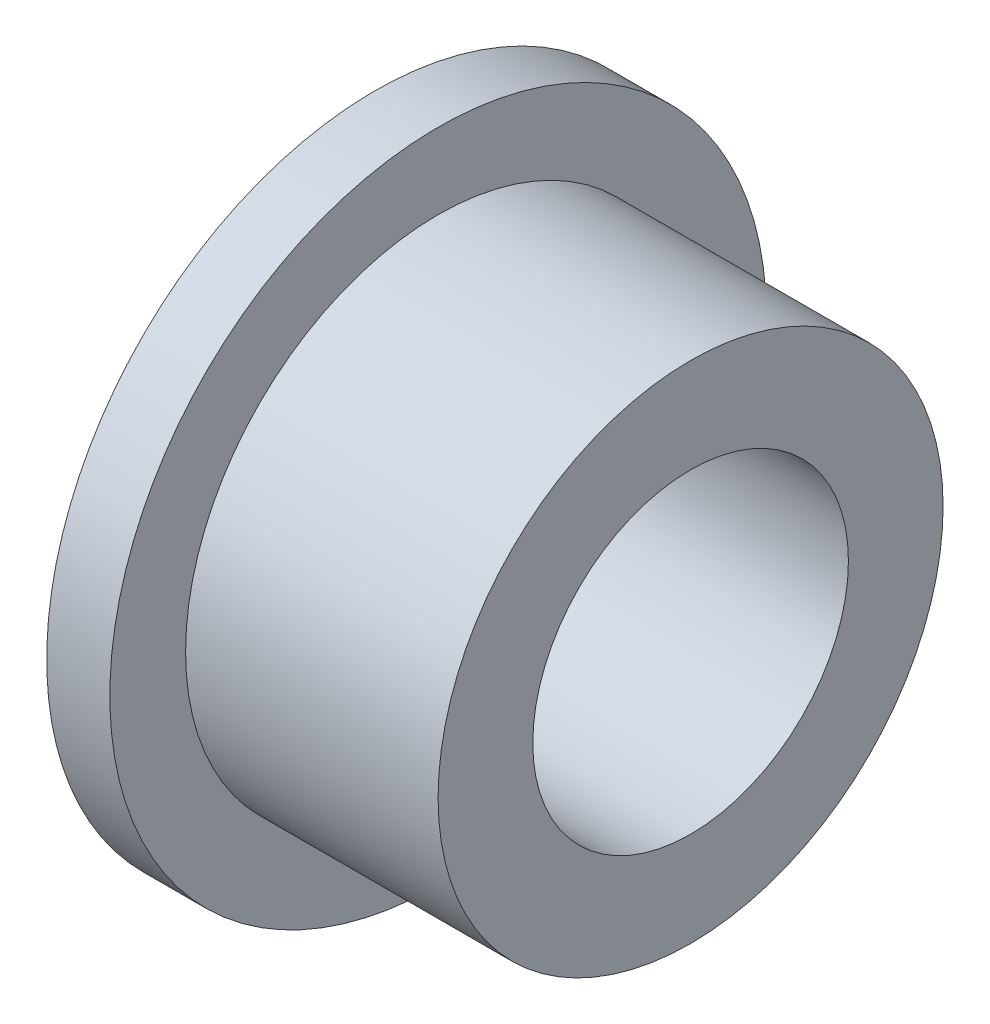
ISO-10303-21;
HEADER;
FILE_DESCRIPTION(('STEP AP214'),'2;1');
FILE_NAME('part.step','',(''),(''),'','','');
FILE_SCHEMA(('AUTOMOTIVE_DESIGN { 1 0 10303 214 1 1 1 1 }'));
ENDSEC;
DATA;
#1=APPLICATION_CONTEXT('core data for automotive mechanical design processes');
#2=APPLICATION_PROTOCOL_DEFINITION('international standard','automotive_design',2000,#1);
#3=PRODUCT_CONTEXT('',#1,'mechanical');
#4=PRODUCT('Part','Part','',(#3));
#5=PRODUCT_RELATED_PRODUCT_CATEGORY('part','',(#4));
#6=PRODUCT_DEFINITION_FORMATION('','',#4);
#7=PRODUCT_DEFINITION_CONTEXT('part definition',#1,'design');
#8=PRODUCT_DEFINITION('design','',#6,#7);
#9=PRODUCT_DEFINITION_SHAPE('','',#8);
#10=(LENGTH_UNIT() NAMED_UNIT(*) SI_UNIT(.MILLI.,.METRE.));
#11=(NAMED_UNIT(*) PLANE_ANGLE_UNIT() SI_UNIT($,.RADIAN.));
#12=(NAMED_UNIT(*) SI_UNIT($,.STERADIAN.) SOLID_ANGLE_UNIT());
#13=UNCERTAINTY_MEASURE_WITH_UNIT(LENGTH_MEASURE(1.E-05),#10,'distance_accuracy_value','');
#14=(GEOMETRIC_REPRESENTATION_CONTEXT(3) GLOBAL_UNCERTAINTY_ASSIGNED_CONTEXT((#13)) GLOBAL_UNIT_ASSIGNED_CONTEXT((#10,
#11,#12)) REPRESENTATION_CONTEXT('',''));
#15=CARTESIAN_POINT('',(0.,0.,0.));
#16=DIRECTION('',(0.,0.,1.));
#17=DIRECTION('',(1.,0.,0.));
#18=AXIS2_PLACEMENT_3D('',#15,#16,#17);
#19=CARTESIAN_POINT('',(2.5,0.,0.));
#20=DIRECTION('',(-1.,0.,0.));
#21=DIRECTION('',(0.,0.,1.));
#22=AXIS2_PLACEMENT_3D('',#19,#20,#21);
#23=CYLINDRICAL_SURFACE('',#22,13.);
#24=CARTESIAN_POINT('',(2.5,0.,0.));
#25=DIRECTION('',(1.,0.,0.));
#26=DIRECTION('',(0.,0.,-1.));
#27=AXIS2_PLACEMENT_3D('',#24,#25,#26);
#28=CIRCLE('',#27,13.);
#29=CARTESIAN_POINT('',(2.5,0.,-13.));
#30=VERTEX_POINT('',#29);
#31=EDGE_CURVE('E51',#30,#30,#28,.T.);
#32=ORIENTED_EDGE('',*,*,#31,.F.);
#33=EDGE_LOOP('',(#32));
#34=FACE_BOUND('',#33,.T.);
#35=CARTESIAN_POINT('',(0.,0.,0.));
#36=DIRECTION('',(1.,0.,0.));
#37=DIRECTION('',(0.,0.,-1.));
#38=AXIS2_PLACEMENT_3D('',#35,#36,#37);
#39=CIRCLE('',#38,13.);
#40=CARTESIAN_POINT('',(0.,0.,-13.));
#41=VERTEX_POINT('',#40);
#42=EDGE_CURVE('E46',#41,#41,#39,.T.);
#43=ORIENTED_EDGE('',*,*,#42,.T.);
#44=EDGE_LOOP('',(#43));
#45=FACE_BOUND('',#44,.T.);
#46=ADVANCED_FACE('F43',(#34,#45),#23,.T.);
#47=CARTESIAN_POINT('',(2.5,0.,0.));
#48=DIRECTION('',(1.,0.,0.));
#49=DIRECTION('',(0.,0.,-1.));
#50=AXIS2_PLACEMENT_3D('',#47,#48,#49);
#51=PLANE('',#50);
#52=CARTESIAN_POINT('',(2.5,0.,0.));
#53=DIRECTION('',(1.,0.,0.));
#54=DIRECTION('',(0.,0.,-1.));
#55=AXIS2_PLACEMENT_3D('',#52,#53,#54);
#56=CIRCLE('',#55,10.);
#57=CARTESIAN_POINT('',(2.5,0.,-10.));
#58=VERTEX_POINT('',#57);
#59=EDGE_CURVE('E10',#58,#58,#56,.T.);
#60=ORIENTED_EDGE('',*,*,#59,.F.);
#61=EDGE_LOOP('',(#60));
#62=FACE_BOUND('',#61,.T.);
#63=ORIENTED_EDGE('',*,*,#31,.T.);
#64=EDGE_LOOP('',(#63));
#65=FACE_BOUND('',#64,.T.);
#66=ADVANCED_FACE('F88',(#62,#65),#51,.T.);
#67=CARTESIAN_POINT('',(0.,0.,0.));
#68=DIRECTION('',(1.,0.,0.));
#69=DIRECTION('',(0.,0.,-1.));
#70=AXIS2_PLACEMENT_3D('',#67,#68,#69);
#71=PLANE('',#70);
#72=CARTESIAN_POINT('',(0.,0.,0.));
#73=DIRECTION('',(1.,0.,0.));
#74=DIRECTION('',(0.,0.,-1.));
#75=AXIS2_PLACEMENT_3D('',#72,#73,#74);
#76=CIRCLE('',#75,6.25);
#77=CARTESIAN_POINT('',(0.,0.,-6.25));
#78=VERTEX_POINT('',#77);
#79=EDGE_CURVE('E62',#78,#78,#76,.T.);
#80=ORIENTED_EDGE('',*,*,#79,.T.);
#81=EDGE_LOOP('',(#80));
#82=FACE_BOUND('',#81,.T.);
#83=ORIENTED_EDGE('',*,*,#42,.F.);
#84=EDGE_LOOP('',(#83));
#85=FACE_BOUND('',#84,.T.);
#86=ADVANCED_FACE('F82',(#82,#85),#71,.F.);
#87=CARTESIAN_POINT('',(12.5,0.,0.));
#88=DIRECTION('',(-1.,0.,0.));
#89=DIRECTION('',(0.,0.,1.));
#90=AXIS2_PLACEMENT_3D('',#87,#88,#89);
#91=CYLINDRICAL_SURFACE('',#90,10.);
#92=CARTESIAN_POINT('',(12.5,0.,0.));
#93=DIRECTION('',(1.,0.,0.));
#94=DIRECTION('',(0.,0.,-1.));
#95=AXIS2_PLACEMENT_3D('',#92,#93,#94);
#96=CIRCLE('',#95,10.);
#97=CARTESIAN_POINT('',(12.5,0.,-10.));
#98=VERTEX_POINT('',#97);
#99=EDGE_CURVE('E58',#98,#98,#96,.T.);
#100=ORIENTED_EDGE('',*,*,#99,.F.);
#101=EDGE_LOOP('',(#100));
#102=FACE_BOUND('',#101,.T.);
#103=ORIENTED_EDGE('',*,*,#59,.T.);
#104=EDGE_LOOP('',(#103));
#105=FACE_BOUND('',#104,.T.);
#106=ADVANCED_FACE('F77',(#102,#105),#91,.T.);
#107=CARTESIAN_POINT('',(12.5,0.,0.));
#108=DIRECTION('',(1.,0.,0.));
#109=DIRECTION('',(0.,0.,-1.));
#110=AXIS2_PLACEMENT_3D('',#107,#108,#109);
#111=PLANE('',#110);
#112=CARTESIAN_POINT('',(12.5,0.,0.));
#113=DIRECTION('',(1.,0.,0.));
#114=DIRECTION('',(0.,0.,-1.));
#115=AXIS2_PLACEMENT_3D('',#112,#113,#114);
#116=CIRCLE('',#115,6.25);
#117=CARTESIAN_POINT('',(12.5,0.,-6.25));
#118=VERTEX_POINT('',#117);
#119=EDGE_CURVE('E66',#118,#118,#116,.T.);
#120=ORIENTED_EDGE('',*,*,#119,.F.);
#121=EDGE_LOOP('',(#120));
#122=FACE_BOUND('',#121,.T.);
#123=ORIENTED_EDGE('',*,*,#99,.T.);
#124=EDGE_LOOP('',(#123));
#125=FACE_BOUND('',#124,.T.);
#126=ADVANCED_FACE('F74',(#122,#125),#111,.T.);
#127=CARTESIAN_POINT('',(-8.5,0.,0.));
#128=DIRECTION('',(1.,0.,0.));
#129=DIRECTION('',(0.,0.,-1.));
#130=AXIS2_PLACEMENT_3D('',#127,#128,#129);
#131=CYLINDRICAL_SURFACE('',#130,6.25);
#132=CARTESIAN_POINT('',(12.5,0.,-6.25));
#133=CARTESIAN_POINT('',(12.3697916666667,0.,-6.25));
#134=CARTESIAN_POINT('',(12.2395833333333,0.,-6.25));
#135=CARTESIAN_POINT('',(11.9791666666667,0.,-6.25));
#136=CARTESIAN_POINT('',(11.8489583333333,0.,-6.25));
#137=CARTESIAN_POINT('',(11.5885416666667,0.,-6.25));
#138=CARTESIAN_POINT('',(11.4583333333333,0.,-6.25));
#139=CARTESIAN_POINT('',(11.1979166666667,0.,-6.25));
#140=CARTESIAN_POINT('',(11.0677083333333,0.,-6.25));
#141=CARTESIAN_POINT('',(10.8072916666667,0.,-6.25));
#142=CARTESIAN_POINT('',(10.6770833333333,0.,-6.25));
#143=CARTESIAN_POINT('',(10.4166666666667,0.,-6.25));
#144=CARTESIAN_POINT('',(10.2864583333333,0.,-6.25));
#145=CARTESIAN_POINT('',(10.0260416666667,0.,-6.25));
#146=CARTESIAN_POINT('',(9.89583333333333,0.,-6.25));
#147=CARTESIAN_POINT('',(9.63541666666667,0.,-6.25));
#148=CARTESIAN_POINT('',(9.50520833333333,0.,-6.25));
#149=CARTESIAN_POINT('',(9.24479166666666,0.,-6.25));
#150=CARTESIAN_POINT('',(9.11458333333333,0.,-6.25));
#151=CARTESIAN_POINT('',(8.85416666666667,0.,-6.25));
#152=CARTESIAN_POINT('',(8.72395833333333,0.,-6.25));
#153=CARTESIAN_POINT('',(8.46354166666667,0.,-6.25));
#154=CARTESIAN_POINT('',(8.33333333333333,0.,-6.25));
#155=CARTESIAN_POINT('',(8.07291666666667,0.,-6.25));
#156=CARTESIAN_POINT('',(7.94270833333333,0.,-6.25));
#157=CARTESIAN_POINT('',(7.68229166666667,0.,-6.25));
#158=CARTESIAN_POINT('',(7.55208333333333,0.,-6.25));
#159=CARTESIAN_POINT('',(7.29166666666667,0.,-6.25));
#160=CARTESIAN_POINT('',(7.16145833333333,0.,-6.25));
#161=CARTESIAN_POINT('',(6.90104166666667,0.,-6.25));
#162=CARTESIAN_POINT('',(6.77083333333333,0.,-6.25));
#163=CARTESIAN_POINT('',(6.51041666666667,0.,-6.25));
#164=CARTESIAN_POINT('',(6.38020833333333,0.,-6.25));
#165=CARTESIAN_POINT('',(6.11979166666667,0.,-6.25));
#166=CARTESIAN_POINT('',(5.98958333333333,0.,-6.25));
#167=CARTESIAN_POINT('',(5.72916666666667,0.,-6.25));
#168=CARTESIAN_POINT('',(5.59895833333333,0.,-6.25));
#169=CARTESIAN_POINT('',(5.33854166666667,0.,-6.25));
#170=CARTESIAN_POINT('',(5.20833333333333,0.,-6.25));
#171=CARTESIAN_POINT('',(4.94791666666667,0.,-6.25));
#172=CARTESIAN_POINT('',(4.81770833333333,0.,-6.25));
#173=CARTESIAN_POINT('',(4.55729166666667,0.,-6.25));
#174=CARTESIAN_POINT('',(4.42708333333333,0.,-6.25));
#175=CARTESIAN_POINT('',(4.16666666666667,0.,-6.25));
#176=CARTESIAN_POINT('',(4.03645833333333,0.,-6.25));
#177=CARTESIAN_POINT('',(3.77604166666667,0.,-6.25));
#178=CARTESIAN_POINT('',(3.64583333333333,0.,-6.25));
#179=CARTESIAN_POINT('',(3.38541666666667,0.,-6.25));
#180=CARTESIAN_POINT('',(3.25520833333333,0.,-6.25));
#181=CARTESIAN_POINT('',(2.99479166666667,0.,-6.25));
#182=CARTESIAN_POINT('',(2.86458333333333,0.,-6.25));
#183=CARTESIAN_POINT('',(2.60416666666667,0.,-6.25));
#184=CARTESIAN_POINT('',(2.47395833333333,0.,-6.25));
#185=CARTESIAN_POINT('',(2.21354166666667,0.,-6.25));
#186=CARTESIAN_POINT('',(2.08333333333333,0.,-6.25));
#187=CARTESIAN_POINT('',(1.82291666666667,0.,-6.25));
#188=CARTESIAN_POINT('',(1.69270833333333,0.,-6.25));
#189=CARTESIAN_POINT('',(1.43229166666667,0.,-6.25));
#190=CARTESIAN_POINT('',(1.30208333333333,0.,-6.25));
#191=CARTESIAN_POINT('',(1.04166666666667,0.,-6.25));
#192=CARTESIAN_POINT('',(0.911458333333332,0.,-6.25));
#193=CARTESIAN_POINT('',(0.651041666666666,0.,-6.25));
#194=CARTESIAN_POINT('',(0.520833333333332,0.,-6.25));
#195=CARTESIAN_POINT('',(0.260416666666665,0.,-6.25));
#196=CARTESIAN_POINT('',(0.130208333333332,0.,-6.25));
#197=CARTESIAN_POINT('',(0.,0.,-6.25));
#198=B_SPLINE_CURVE_WITH_KNOTS('',3,(#132,#133,#134,#135,#136,#137,#138,#139,#140,#141,#142,
#143,#144,#145,#146,#147,#148,#149,#150,#151,#152,#153,#154,#155,#156,#157,#158,#159,#160,#161,
#162,#163,#164,#165,#166,#167,#168,#169,#170,#171,#172,#173,#174,#175,#176,#177,#178,#179,#180,
#181,#182,#183,#184,#185,#186,#187,#188,#189,#190,#191,#192,#193,#194,#195,#196,#197),
.UNSPECIFIED.,.F.,.F.,(4,2,2,2,2,2,2,2,2,2,2,2,2,2,2,2,2,2,2,2,2,2,2,2,2,2,2,2,2,2,2,2,4),(0.,
0.390624999999999,0.781250000000001,1.171875,1.5625,1.953125,2.34375,2.734375,3.125,3.515625,
3.90625,4.296875,4.6875,5.078125,5.46875,5.859375,6.25,6.640625,7.03125,7.421875,7.8125,
8.203125,8.59375,8.984375,9.375,9.765625,10.15625,10.546875,10.9375,11.328125,11.71875,
12.109375,12.5),.UNSPECIFIED.);
#199=EDGE_CURVE('BSEAM71',#118,#78,#198,.T.);
#200=ORIENTED_EDGE('',*,*,#119,.T.);
#201=ORIENTED_EDGE('',*,*,#79,.F.);
#202=ORIENTED_EDGE('',*,*,#199,.T.);
#203=ORIENTED_EDGE('',*,*,#199,.F.);
#204=EDGE_LOOP('',(#200,#202,#201,#203));
#205=FACE_BOUND('',#204,.T.);
#206=ADVANCED_FACE('F71',(#205),#131,.F.);
#207=CLOSED_SHELL('',(#46,#66,#86,#106,#126,#206));
#208=MANIFOLD_SOLID_BREP('B2',#207);
#209=ADVANCED_BREP_SHAPE_REPRESENTATION('',(#18,#208),#14);
#210=SHAPE_DEFINITION_REPRESENTATION(#9,#209);
ENDSEC;
END-ISO-10303-21;
